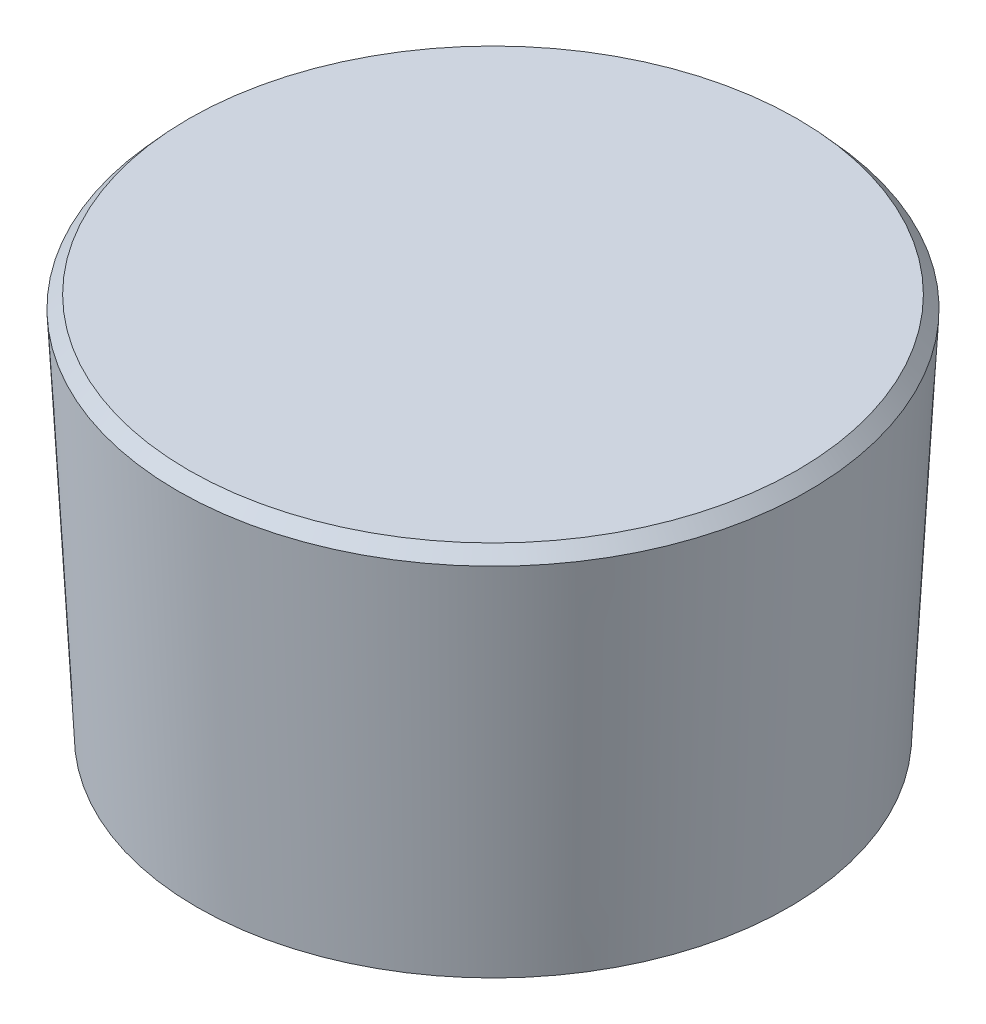
ISO-10303-21;
HEADER;
FILE_DESCRIPTION(('STEP AP214'),'2;1');
FILE_NAME('part.step','',(''),(''),'','','');
FILE_SCHEMA(('AUTOMOTIVE_DESIGN { 1 0 10303 214 1 1 1 1 }'));
ENDSEC;
DATA;
#1=APPLICATION_CONTEXT('core data for automotive mechanical design processes');
#2=APPLICATION_PROTOCOL_DEFINITION('international standard','automotive_design',2000,#1);
#3=PRODUCT_CONTEXT('',#1,'mechanical');
#4=PRODUCT('Part','Part','',(#3));
#5=PRODUCT_RELATED_PRODUCT_CATEGORY('part','',(#4));
#6=PRODUCT_DEFINITION_FORMATION('','',#4);
#7=PRODUCT_DEFINITION_CONTEXT('part definition',#1,'design');
#8=PRODUCT_DEFINITION('design','',#6,#7);
#9=PRODUCT_DEFINITION_SHAPE('','',#8);
#10=(LENGTH_UNIT() NAMED_UNIT(*) SI_UNIT(.MILLI.,.METRE.));
#11=(NAMED_UNIT(*) PLANE_ANGLE_UNIT() SI_UNIT($,.RADIAN.));
#12=(NAMED_UNIT(*) SI_UNIT($,.STERADIAN.) SOLID_ANGLE_UNIT());
#13=UNCERTAINTY_MEASURE_WITH_UNIT(LENGTH_MEASURE(1.E-05),#10,'distance_accuracy_value','');
#14=(GEOMETRIC_REPRESENTATION_CONTEXT(3) GLOBAL_UNCERTAINTY_ASSIGNED_CONTEXT((#13)) GLOBAL_UNIT_ASSIGNED_CONTEXT((#10,
#11,#12)) REPRESENTATION_CONTEXT('',''));
#15=CARTESIAN_POINT('',(0.,0.,0.));
#16=DIRECTION('',(0.,0.,1.));
#17=DIRECTION('',(1.,0.,0.));
#18=AXIS2_PLACEMENT_3D('',#15,#16,#17);
#19=CARTESIAN_POINT('',(0.,0.,0.));
#20=DIRECTION('',(0.,1.,0.));
#21=DIRECTION('',(0.,0.,1.));
#22=AXIS2_PLACEMENT_3D('',#19,#20,#21);
#23=CONICAL_SURFACE('',#22,5.122,0.05235987755983);
#24=CARTESIAN_POINT('',(0.,-0.199725906950915,0.));
#25=DIRECTION('',(0.,-1.,0.));
#26=DIRECTION('',(0.,0.,-1.));
#27=AXIS2_PLACEMENT_3D('',#24,#25,#26);
#28=CIRCLE('',#27,5.11153280875141);
#29=CARTESIAN_POINT('',(0.,-0.199725906950915,-5.11153280875141));
#30=VERTEX_POINT('',#29);
#31=EDGE_CURVE('E10',#30,#30,#28,.T.);
#32=ORIENTED_EDGE('',*,*,#31,.T.);
#33=EDGE_LOOP('',(#32));
#34=FACE_BOUND('',#33,.T.);
#35=CARTESIAN_POINT('',(0.,-6.2,0.));
#36=DIRECTION('',(0.,1.,0.));
#37=DIRECTION('',(0.,0.,1.));
#38=AXIS2_PLACEMENT_3D('',#35,#36,#37);
#39=CIRCLE('',#38,4.79707176844514);
#40=CARTESIAN_POINT('',(0.,-6.2,4.79707176844514));
#41=VERTEX_POINT('',#40);
#42=EDGE_CURVE('E42',#41,#41,#39,.T.);
#43=ORIENTED_EDGE('',*,*,#42,.T.);
#44=EDGE_LOOP('',(#43));
#45=FACE_BOUND('',#44,.T.);
#46=ADVANCED_FACE('F31',(#34,#45),#23,.T.);
#47=CARTESIAN_POINT('',(0.,-6.2,0.));
#48=DIRECTION('',(0.,1.,0.));
#49=DIRECTION('',(0.,0.,1.));
#50=AXIS2_PLACEMENT_3D('',#47,#48,#49);
#51=PLANE('',#50);
#52=ORIENTED_EDGE('',*,*,#42,.F.);
#53=EDGE_LOOP('',(#52));
#54=FACE_BOUND('',#53,.T.);
#55=ADVANCED_FACE('F50',(#54),#51,.F.);
#56=CARTESIAN_POINT('',(0.,0.,0.));
#57=DIRECTION('',(0.,1.,0.));
#58=DIRECTION('',(0.,0.,1.));
#59=AXIS2_PLACEMENT_3D('',#56,#57,#58);
#60=PLANE('',#59);
#61=CARTESIAN_POINT('',(0.,0.,0.));
#62=DIRECTION('',(0.,1.,0.));
#63=DIRECTION('',(0.,0.,1.));
#64=AXIS2_PLACEMENT_3D('',#61,#62,#63);
#65=CIRCLE('',#64,4.93169879438175);
#66=CARTESIAN_POINT('',(0.,0.,4.93169879438175));
#67=VERTEX_POINT('',#66);
#68=EDGE_CURVE('E38',#67,#67,#65,.T.);
#69=ORIENTED_EDGE('',*,*,#68,.T.);
#70=EDGE_LOOP('',(#69));
#71=FACE_BOUND('',#70,.T.);
#72=ADVANCED_FACE('F52',(#71),#60,.T.);
#73=CARTESIAN_POINT('',(0.,0.,0.));
#74=DIRECTION('',(0.,-1.,0.));
#75=DIRECTION('',(0.,0.,-1.));
#76=AXIS2_PLACEMENT_3D('',#73,#74,#75);
#77=CONICAL_SURFACE('',#76,4.93169879438175,0.733038285837619);
#78=ORIENTED_EDGE('',*,*,#31,.F.);
#79=EDGE_LOOP('',(#78));
#80=FACE_BOUND('',#79,.T.);
#81=ORIENTED_EDGE('',*,*,#68,.F.);
#82=EDGE_LOOP('',(#81));
#83=FACE_BOUND('',#82,.T.);
#84=ADVANCED_FACE('F33',(#80,#83),#77,.T.);
#85=CLOSED_SHELL('',(#46,#55,#72,#84));
#86=MANIFOLD_SOLID_BREP('B2',#85);
#87=ADVANCED_BREP_SHAPE_REPRESENTATION('',(#18,#86),#14);
#88=SHAPE_DEFINITION_REPRESENTATION(#9,#87);
ENDSEC;
END-ISO-10303-21;
